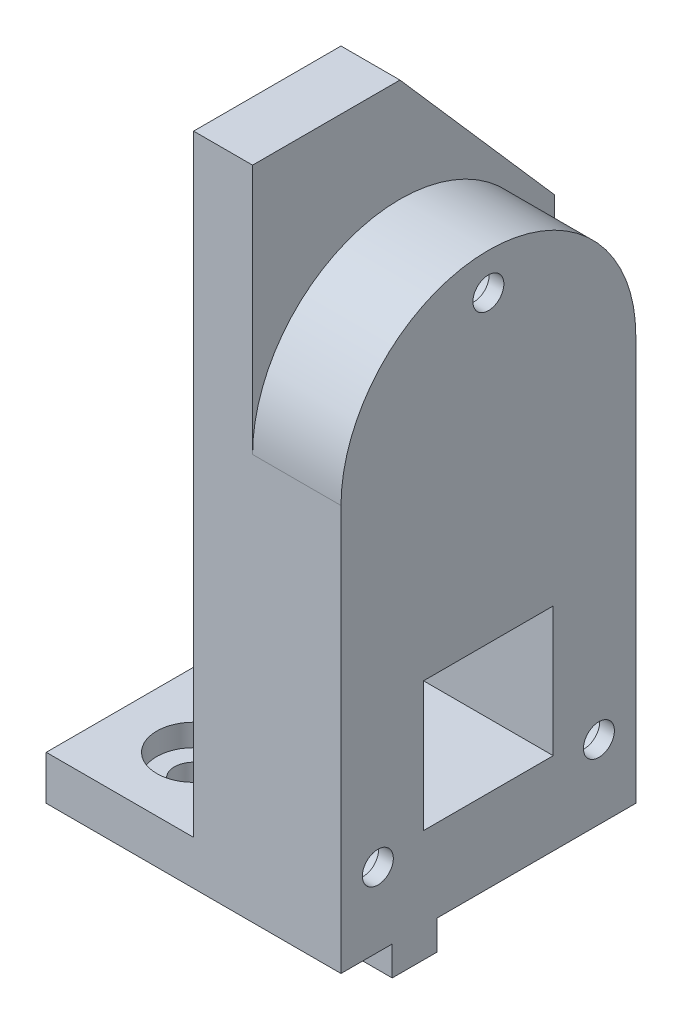
ISO-10303-21;
HEADER;
FILE_DESCRIPTION(('STEP AP214'),'2;1');
FILE_NAME('part.step','',(''),(''),'','','');
FILE_SCHEMA(('AUTOMOTIVE_DESIGN { 1 0 10303 214 1 1 1 1 }'));
ENDSEC;
DATA;
#1=APPLICATION_CONTEXT('core data for automotive mechanical design processes');
#2=APPLICATION_PROTOCOL_DEFINITION('international standard','automotive_design',2000,#1);
#3=PRODUCT_CONTEXT('',#1,'mechanical');
#4=PRODUCT('Part','Part','',(#3));
#5=PRODUCT_RELATED_PRODUCT_CATEGORY('part','',(#4));
#6=PRODUCT_DEFINITION_FORMATION('','',#4);
#7=PRODUCT_DEFINITION_CONTEXT('part definition',#1,'design');
#8=PRODUCT_DEFINITION('design','',#6,#7);
#9=PRODUCT_DEFINITION_SHAPE('','',#8);
#10=(LENGTH_UNIT() NAMED_UNIT(*) SI_UNIT(.MILLI.,.METRE.));
#11=(NAMED_UNIT(*) PLANE_ANGLE_UNIT() SI_UNIT($,.RADIAN.));
#12=(NAMED_UNIT(*) SI_UNIT($,.STERADIAN.) SOLID_ANGLE_UNIT());
#13=UNCERTAINTY_MEASURE_WITH_UNIT(LENGTH_MEASURE(1.E-05),#10,'distance_accuracy_value','');
#14=(GEOMETRIC_REPRESENTATION_CONTEXT(3) GLOBAL_UNCERTAINTY_ASSIGNED_CONTEXT((#13)) GLOBAL_UNIT_ASSIGNED_CONTEXT((#10,
#11,#12)) REPRESENTATION_CONTEXT('',''));
#15=CARTESIAN_POINT('',(0.,0.,0.));
#16=DIRECTION('',(0.,0.,1.));
#17=DIRECTION('',(1.,0.,0.));
#18=AXIS2_PLACEMENT_3D('',#15,#16,#17);
#19=CARTESIAN_POINT('',(-10.,6.,0.));
#20=DIRECTION('',(-1.,0.,0.));
#21=DIRECTION('',(0.,0.,1.));
#22=AXIS2_PLACEMENT_3D('',#19,#20,#21);
#23=PLANE('',#22);
#24=CARTESIAN_POINT('',(-10.,70.,0.));
#25=DIRECTION('',(-1.,0.,0.));
#26=DIRECTION('',(0.,0.,1.));
#27=AXIS2_PLACEMENT_3D('',#24,#25,#26);
#28=CIRCLE('',#27,3.5);
#29=CARTESIAN_POINT('',(-10.,70.,3.5));
#30=VERTEX_POINT('',#29);
#31=EDGE_CURVE('E287',#30,#30,#28,.T.);
#32=ORIENTED_EDGE('',*,*,#31,.F.);
#33=EDGE_LOOP('',(#32));
#34=FACE_BOUND('',#33,.T.);
#35=CARTESIAN_POINT('',(-10.,10.,-15.));
#36=DIRECTION('',(-1.,0.,0.));
#37=DIRECTION('',(0.,0.,1.));
#38=AXIS2_PLACEMENT_3D('',#35,#36,#37);
#39=CIRCLE('',#38,3.5);
#40=CARTESIAN_POINT('',(-10.,10.,-11.5));
#41=VERTEX_POINT('',#40);
#42=EDGE_CURVE('E294',#41,#41,#39,.T.);
#43=ORIENTED_EDGE('',*,*,#42,.F.);
#44=EDGE_LOOP('',(#43));
#45=FACE_BOUND('',#44,.T.);
#46=CARTESIAN_POINT('',(-10.,10.,15.));
#47=DIRECTION('',(-1.,0.,0.));
#48=DIRECTION('',(0.,0.,1.));
#49=AXIS2_PLACEMENT_3D('',#46,#47,#48);
#50=CIRCLE('',#49,3.5);
#51=CARTESIAN_POINT('',(-10.,10.,18.5));
#52=VERTEX_POINT('',#51);
#53=EDGE_CURVE('E298',#52,#52,#50,.T.);
#54=ORIENTED_EDGE('',*,*,#53,.F.);
#55=EDGE_LOOP('',(#54));
#56=FACE_BOUND('',#55,.T.);
#57=DIRECTION('',(0.,0.,1.));
#58=VECTOR('',#57,1.);
#59=CARTESIAN_POINT('',(-10.,28.8,0.));
#60=LINE('',#59,#58);
#61=CARTESIAN_POINT('',(-10.,28.8,-8.8));
#62=VERTEX_POINT('',#61);
#63=CARTESIAN_POINT('',(-10.,28.8,8.8));
#64=VERTEX_POINT('',#63);
#65=EDGE_CURVE('E310',#62,#64,#60,.T.);
#66=ORIENTED_EDGE('',*,*,#65,.T.);
#67=DIRECTION('',(0.,-1.,0.));
#68=VECTOR('',#67,1.);
#69=CARTESIAN_POINT('',(-10.,0.,8.8));
#70=LINE('',#69,#68);
#71=CARTESIAN_POINT('',(-10.,11.2,8.8));
#72=VERTEX_POINT('',#71);
#73=EDGE_CURVE('E307',#64,#72,#70,.T.);
#74=ORIENTED_EDGE('',*,*,#73,.T.);
#75=DIRECTION('',(0.,0.,1.));
#76=VECTOR('',#75,1.);
#77=CARTESIAN_POINT('',(-10.,11.2,0.));
#78=LINE('',#77,#76);
#79=CARTESIAN_POINT('',(-10.,11.2,-8.8));
#80=VERTEX_POINT('',#79);
#81=EDGE_CURVE('E317',#80,#72,#78,.T.);
#82=ORIENTED_EDGE('',*,*,#81,.F.);
#83=DIRECTION('',(0.,-1.,0.));
#84=VECTOR('',#83,1.);
#85=CARTESIAN_POINT('',(-10.,0.,-8.8));
#86=LINE('',#85,#84);
#87=EDGE_CURVE('E314',#62,#80,#86,.T.);
#88=ORIENTED_EDGE('',*,*,#87,.F.);
#89=EDGE_LOOP('',(#66,#74,#82,#88));
#90=FACE_BOUND('',#89,.T.);
#91=DIRECTION('',(0.,-1.,0.));
#92=VECTOR('',#91,1.);
#93=CARTESIAN_POINT('',(-10.,3.,0.));
#94=LINE('',#93,#92);
#95=CARTESIAN_POINT('',(-10.,6.,0.));
#96=VERTEX_POINT('',#95);
#97=CARTESIAN_POINT('',(-10.,0.,0.));
#98=VERTEX_POINT('',#97);
#99=EDGE_CURVE('E65',#96,#98,#94,.T.);
#100=ORIENTED_EDGE('',*,*,#99,.F.);
#101=DIRECTION('',(0.,0.,1.));
#102=VECTOR('',#101,1.);
#103=CARTESIAN_POINT('',(-10.,6.,0.));
#104=LINE('',#103,#102);
#105=CARTESIAN_POINT('',(-10.,6.00000000000001,20.));
#106=VERTEX_POINT('',#105);
#107=EDGE_CURVE('E69',#96,#106,#104,.T.);
#108=ORIENTED_EDGE('',*,*,#107,.T.);
#109=DIRECTION('',(0.,-1.,0.));
#110=VECTOR('',#109,1.);
#111=CARTESIAN_POINT('',(-10.,75.,20.));
#112=LINE('',#111,#110);
#113=CARTESIAN_POINT('',(-10.,89.,20.));
#114=VERTEX_POINT('',#113);
#115=EDGE_CURVE('E323',#114,#106,#112,.T.);
#116=ORIENTED_EDGE('',*,*,#115,.F.);
#117=DIRECTION('',(0.,0.,-1.));
#118=VECTOR('',#117,1.);
#119=CARTESIAN_POINT('',(-10.,89.,20.));
#120=LINE('',#119,#118);
#121=CARTESIAN_POINT('',(-10.,89.,0.));
#122=VERTEX_POINT('',#121);
#123=EDGE_CURVE('E217',#114,#122,#120,.T.);
#124=ORIENTED_EDGE('',*,*,#123,.T.);
#125=DIRECTION('',(0.,0.752576694706878,0.658504607868518));
#126=VECTOR('',#125,1.);
#127=CARTESIAN_POINT('',(-10.,65.,-21.));
#128=LINE('',#127,#126);
#129=CARTESIAN_POINT('',(-10.,65.,-21.));
#130=VERTEX_POINT('',#129);
#131=EDGE_CURVE('E238',#130,#122,#128,.T.);
#132=ORIENTED_EDGE('',*,*,#131,.F.);
#133=DIRECTION('',(0.,1.,0.));
#134=VECTOR('',#133,1.);
#135=CARTESIAN_POINT('',(-10.,0.,-21.));
#136=LINE('',#135,#134);
#137=CARTESIAN_POINT('',(-10.,0.,-21.));
#138=VERTEX_POINT('',#137);
#139=EDGE_CURVE('E221',#138,#130,#136,.T.);
#140=ORIENTED_EDGE('',*,*,#139,.F.);
#141=DIRECTION('',(0.,0.,-1.));
#142=VECTOR('',#141,1.);
#143=CARTESIAN_POINT('',(-10.,0.,0.));
#144=LINE('',#143,#142);
#145=EDGE_CURVE('E336',#98,#138,#144,.T.);
#146=ORIENTED_EDGE('',*,*,#145,.F.);
#147=EDGE_LOOP('',(#100,#108,#116,#124,#132,#140,#146));
#148=FACE_BOUND('',#147,.T.);
#149=ADVANCED_FACE('F51',(#34,#45,#56,#90,#148),#23,.T.);
#150=CARTESIAN_POINT('',(0.,3.,0.));
#151=DIRECTION('',(0.,1.,0.));
#152=DIRECTION('',(0.,0.,1.));
#153=AXIS2_PLACEMENT_3D('',#150,#151,#152);
#154=PLANE('',#153);
#155=CARTESIAN_POINT('',(-20.,3.,9.99999999999999));
#156=DIRECTION('',(0.,1.,0.));
#157=DIRECTION('',(0.,0.,1.));
#158=AXIS2_PLACEMENT_3D('',#155,#156,#157);
#159=CIRCLE('',#158,2.6);
#160=CARTESIAN_POINT('',(-20.,3.,12.6));
#161=VERTEX_POINT('',#160);
#162=EDGE_CURVE('E209',#161,#161,#159,.T.);
#163=ORIENTED_EDGE('',*,*,#162,.F.);
#164=EDGE_LOOP('',(#163));
#165=FACE_BOUND('',#164,.T.);
#166=CARTESIAN_POINT('',(-20.,3.,9.99999999999999));
#167=DIRECTION('',(0.,1.,0.));
#168=DIRECTION('',(0.,0.,1.));
#169=AXIS2_PLACEMENT_3D('',#166,#167,#168);
#170=CIRCLE('',#169,5.);
#171=CARTESIAN_POINT('',(-20.,3.,15.));
#172=VERTEX_POINT('',#171);
#173=EDGE_CURVE('E12',#172,#172,#170,.F.);
#174=ORIENTED_EDGE('',*,*,#173,.F.);
#175=EDGE_LOOP('',(#174));
#176=FACE_BOUND('',#175,.T.);
#177=ADVANCED_FACE('F373',(#165,#176),#154,.T.);
#178=DIRECTION('',(0.,1.,0.));
#179=VECTOR('',#178,1.);
#180=CARTESIAN_POINT('',(-10.,-4.,13.05));
#181=LINE('',#180,#179);
#182=CARTESIAN_POINT('',(-10.,-4.,13.05));
#183=VERTEX_POINT('',#182);
#184=CARTESIAN_POINT('',(-10.,0.,13.05));
#185=VERTEX_POINT('',#184);
#186=EDGE_CURVE('E283',#183,#185,#181,.T.);
#187=ORIENTED_EDGE('',*,*,#186,.T.);
#188=DIRECTION('',(0.,0.,-1.));
#189=VECTOR('',#188,1.);
#190=CARTESIAN_POINT('',(-10.,0.,20.));
#191=LINE('',#190,#189);
#192=CARTESIAN_POINT('',(-10.,0.,6.94999999999999));
#193=VERTEX_POINT('',#192);
#194=EDGE_CURVE('E58',#185,#193,#191,.T.);
#195=ORIENTED_EDGE('',*,*,#194,.T.);
#196=DIRECTION('',(0.,1.,0.));
#197=VECTOR('',#196,1.);
#198=CARTESIAN_POINT('',(-10.,-4.,6.94999999999999));
#199=LINE('',#198,#197);
#200=CARTESIAN_POINT('',(-10.,-4.,6.94999999999999));
#201=VERTEX_POINT('',#200);
#202=EDGE_CURVE('E280',#201,#193,#199,.T.);
#203=ORIENTED_EDGE('',*,*,#202,.F.);
#204=DIRECTION('',(0.,0.,-1.));
#205=VECTOR('',#204,1.);
#206=CARTESIAN_POINT('',(-10.,-4.,0.));
#207=LINE('',#206,#205);
#208=EDGE_CURVE('E262',#183,#201,#207,.T.);
#209=ORIENTED_EDGE('',*,*,#208,.F.);
#210=EDGE_LOOP('',(#187,#195,#203,#209));
#211=FACE_BOUND('',#210,.T.);
#212=ADVANCED_FACE('F376',(#211),#23,.T.);
#213=CARTESIAN_POINT('',(65.,10.,15.));
#214=DIRECTION('',(-1.,0.,0.));
#215=DIRECTION('',(0.,0.,1.));
#216=AXIS2_PLACEMENT_3D('',#213,#214,#215);
#217=CYLINDRICAL_SURFACE('',#216,2.1);
#218=CARTESIAN_POINT('',(10.,10.,15.));
#219=DIRECTION('',(-1.,0.,0.));
#220=DIRECTION('',(0.,0.,1.));
#221=AXIS2_PLACEMENT_3D('',#218,#219,#220);
#222=CIRCLE('',#221,2.1);
#223=CARTESIAN_POINT('',(10.,10.,17.1));
#224=VERTEX_POINT('',#223);
#225=EDGE_CURVE('E306',#224,#224,#222,.T.);
#226=ORIENTED_EDGE('',*,*,#225,.F.);
#227=EDGE_LOOP('',(#226));
#228=FACE_BOUND('',#227,.T.);
#229=CARTESIAN_POINT('',(8.,10.,15.));
#230=DIRECTION('',(-1.,0.,0.));
#231=DIRECTION('',(0.,0.,1.));
#232=AXIS2_PLACEMENT_3D('',#229,#230,#231);
#233=CIRCLE('',#232,2.1);
#234=CARTESIAN_POINT('',(8.,10.,17.1));
#235=VERTEX_POINT('',#234);
#236=EDGE_CURVE('E272',#235,#235,#233,.F.);
#237=ORIENTED_EDGE('',*,*,#236,.F.);
#238=EDGE_LOOP('',(#237));
#239=FACE_BOUND('',#238,.T.);
#240=ADVANCED_FACE('F396',(#228,#239),#217,.F.);
#241=CARTESIAN_POINT('',(65.,10.,-15.));
#242=DIRECTION('',(-1.,0.,0.));
#243=DIRECTION('',(0.,0.,1.));
#244=AXIS2_PLACEMENT_3D('',#241,#242,#243);
#245=CYLINDRICAL_SURFACE('',#244,2.1);
#246=CARTESIAN_POINT('',(10.,10.,-15.));
#247=DIRECTION('',(-1.,0.,0.));
#248=DIRECTION('',(0.,0.,1.));
#249=AXIS2_PLACEMENT_3D('',#246,#247,#248);
#250=CIRCLE('',#249,2.1);
#251=CARTESIAN_POINT('',(10.,10.,-12.9));
#252=VERTEX_POINT('',#251);
#253=EDGE_CURVE('E355',#252,#252,#250,.T.);
#254=ORIENTED_EDGE('',*,*,#253,.F.);
#255=EDGE_LOOP('',(#254));
#256=FACE_BOUND('',#255,.T.);
#257=CARTESIAN_POINT('',(8.,10.,-15.));
#258=DIRECTION('',(-1.,0.,0.));
#259=DIRECTION('',(0.,0.,1.));
#260=AXIS2_PLACEMENT_3D('',#257,#258,#259);
#261=CIRCLE('',#260,2.1);
#262=CARTESIAN_POINT('',(8.,10.,-12.9));
#263=VERTEX_POINT('',#262);
#264=EDGE_CURVE('E256',#263,#263,#261,.F.);
#265=ORIENTED_EDGE('',*,*,#264,.F.);
#266=EDGE_LOOP('',(#265));
#267=FACE_BOUND('',#266,.T.);
#268=ADVANCED_FACE('F401',(#256,#267),#245,.F.);
#269=CARTESIAN_POINT('',(65.,70.,0.));
#270=DIRECTION('',(-1.,0.,0.));
#271=DIRECTION('',(0.,0.,1.));
#272=AXIS2_PLACEMENT_3D('',#269,#270,#271);
#273=CYLINDRICAL_SURFACE('',#272,2.1);
#274=CARTESIAN_POINT('',(10.,70.,0.));
#275=DIRECTION('',(-1.,0.,0.));
#276=DIRECTION('',(0.,0.,1.));
#277=AXIS2_PLACEMENT_3D('',#274,#275,#276);
#278=CIRCLE('',#277,2.1);
#279=CARTESIAN_POINT('',(10.,70.,2.1));
#280=VERTEX_POINT('',#279);
#281=EDGE_CURVE('E311',#280,#280,#278,.T.);
#282=ORIENTED_EDGE('',*,*,#281,.F.);
#283=EDGE_LOOP('',(#282));
#284=FACE_BOUND('',#283,.T.);
#285=CARTESIAN_POINT('',(8.,70.,0.));
#286=DIRECTION('',(-1.,0.,0.));
#287=DIRECTION('',(0.,-1.,0.));
#288=AXIS2_PLACEMENT_3D('',#285,#286,#287);
#289=CIRCLE('',#288,2.1);
#290=CARTESIAN_POINT('',(8.,67.9,0.));
#291=VERTEX_POINT('',#290);
#292=EDGE_CURVE('E293',#291,#291,#289,.F.);
#293=ORIENTED_EDGE('',*,*,#292,.F.);
#294=EDGE_LOOP('',(#293));
#295=FACE_BOUND('',#294,.T.);
#296=ADVANCED_FACE('F477',(#284,#295),#273,.F.);
#297=CARTESIAN_POINT('',(10.,6.,0.));
#298=DIRECTION('',(-1.,0.,0.));
#299=DIRECTION('',(0.,0.,1.));
#300=AXIS2_PLACEMENT_3D('',#297,#298,#299);
#301=PLANE('',#300);
#302=ORIENTED_EDGE('',*,*,#281,.T.);
#303=EDGE_LOOP('',(#302));
#304=FACE_BOUND('',#303,.T.);
#305=ORIENTED_EDGE('',*,*,#253,.T.);
#306=EDGE_LOOP('',(#305));
#307=FACE_BOUND('',#306,.T.);
#308=ORIENTED_EDGE('',*,*,#225,.T.);
#309=EDGE_LOOP('',(#308));
#310=FACE_BOUND('',#309,.T.);
#311=DIRECTION('',(0.,-1.,0.));
#312=VECTOR('',#311,1.);
#313=CARTESIAN_POINT('',(10.,6.,8.8));
#314=LINE('',#313,#312);
#315=CARTESIAN_POINT('',(10.,28.8,8.8));
#316=VERTEX_POINT('',#315);
#317=CARTESIAN_POINT('',(10.,11.2,8.8));
#318=VERTEX_POINT('',#317);
#319=EDGE_CURVE('E350',#316,#318,#314,.T.);
#320=ORIENTED_EDGE('',*,*,#319,.F.);
#321=DIRECTION('',(0.,0.,1.));
#322=VECTOR('',#321,1.);
#323=CARTESIAN_POINT('',(10.,28.8,0.));
#324=LINE('',#323,#322);
#325=CARTESIAN_POINT('',(10.,28.8,-8.8));
#326=VERTEX_POINT('',#325);
#327=EDGE_CURVE('E342',#326,#316,#324,.T.);
#328=ORIENTED_EDGE('',*,*,#327,.F.);
#329=DIRECTION('',(0.,-1.,0.));
#330=VECTOR('',#329,1.);
#331=CARTESIAN_POINT('',(10.,6.,-8.8));
#332=LINE('',#331,#330);
#333=CARTESIAN_POINT('',(10.,11.2,-8.8));
#334=VERTEX_POINT('',#333);
#335=EDGE_CURVE('E344',#326,#334,#332,.T.);
#336=ORIENTED_EDGE('',*,*,#335,.T.);
#337=DIRECTION('',(0.,0.,1.));
#338=VECTOR('',#337,1.);
#339=CARTESIAN_POINT('',(10.,11.2,0.));
#340=LINE('',#339,#338);
#341=EDGE_CURVE('E347',#334,#318,#340,.T.);
#342=ORIENTED_EDGE('',*,*,#341,.T.);
#343=EDGE_LOOP('',(#320,#328,#336,#342));
#344=FACE_BOUND('',#343,.T.);
#345=DIRECTION('',(0.,0.,-1.));
#346=VECTOR('',#345,1.);
#347=CARTESIAN_POINT('',(10.,0.,0.));
#348=LINE('',#347,#346);
#349=CARTESIAN_POINT('',(10.,0.,20.));
#350=VERTEX_POINT('',#349);
#351=CARTESIAN_POINT('',(10.,0.,13.05));
#352=VERTEX_POINT('',#351);
#353=EDGE_CURVE('E339',#350,#352,#348,.T.);
#354=ORIENTED_EDGE('',*,*,#353,.T.);
#355=DIRECTION('',(0.,1.,0.));
#356=VECTOR('',#355,1.);
#357=CARTESIAN_POINT('',(10.,-4.,13.05));
#358=LINE('',#357,#356);
#359=CARTESIAN_POINT('',(10.,-4.,13.05));
#360=VERTEX_POINT('',#359);
#361=EDGE_CURVE('E269',#360,#352,#358,.T.);
#362=ORIENTED_EDGE('',*,*,#361,.F.);
#363=DIRECTION('',(0.,0.,1.));
#364=VECTOR('',#363,1.);
#365=CARTESIAN_POINT('',(10.,-4.,0.));
#366=LINE('',#365,#364);
#367=CARTESIAN_POINT('',(10.,-4.,6.94999999999999));
#368=VERTEX_POINT('',#367);
#369=EDGE_CURVE('E267',#368,#360,#366,.T.);
#370=ORIENTED_EDGE('',*,*,#369,.F.);
#371=DIRECTION('',(0.,1.,0.));
#372=VECTOR('',#371,1.);
#373=CARTESIAN_POINT('',(10.,-4.,6.94999999999999));
#374=LINE('',#373,#372);
#375=CARTESIAN_POINT('',(10.,0.,6.94999999999999));
#376=VERTEX_POINT('',#375);
#377=EDGE_CURVE('E277',#368,#376,#374,.T.);
#378=ORIENTED_EDGE('',*,*,#377,.T.);
#379=CARTESIAN_POINT('',(10.,0.,-20.));
#380=VERTEX_POINT('',#379);
#381=EDGE_CURVE('E338',#376,#380,#348,.T.);
#382=ORIENTED_EDGE('',*,*,#381,.T.);
#383=DIRECTION('',(0.,-1.,0.));
#384=VECTOR('',#383,1.);
#385=CARTESIAN_POINT('',(10.,75.,-20.));
#386=LINE('',#385,#384);
#387=CARTESIAN_POINT('',(10.,55.,-20.));
#388=VERTEX_POINT('',#387);
#389=EDGE_CURVE('E331',#388,#380,#386,.T.);
#390=ORIENTED_EDGE('',*,*,#389,.F.);
#391=CARTESIAN_POINT('',(10.,55.,0.));
#392=DIRECTION('',(-1.,0.,0.));
#393=DIRECTION('',(0.,0.,1.));
#394=AXIS2_PLACEMENT_3D('',#391,#392,#393);
#395=CIRCLE('',#394,20.);
#396=CARTESIAN_POINT('',(10.,55.,20.));
#397=VERTEX_POINT('',#396);
#398=EDGE_CURVE('E303',#388,#397,#395,.F.);
#399=ORIENTED_EDGE('',*,*,#398,.T.);
#400=DIRECTION('',(0.,-1.,0.));
#401=VECTOR('',#400,1.);
#402=CARTESIAN_POINT('',(10.,75.,20.));
#403=LINE('',#402,#401);
#404=EDGE_CURVE('E334',#397,#350,#403,.T.);
#405=ORIENTED_EDGE('',*,*,#404,.T.);
#406=EDGE_LOOP('',(#354,#362,#370,#378,#382,#390,#399,#405));
#407=FACE_BOUND('',#406,.T.);
#408=ADVANCED_FACE('F425',(#304,#307,#310,#344,#407),#301,.F.);
#409=CARTESIAN_POINT('',(-10.,75.,20.));
#410=DIRECTION('',(0.,0.,-1.));
#411=DIRECTION('',(-1.,0.,0.));
#412=AXIS2_PLACEMENT_3D('',#409,#410,#411);
#413=PLANE('',#412);
#414=DIRECTION('',(-1.,0.,0.));
#415=VECTOR('',#414,1.);
#416=CARTESIAN_POINT('',(65.,55.,20.));
#417=LINE('',#416,#415);
#418=CARTESIAN_POINT('',(-2.,55.,20.));
#419=VERTEX_POINT('',#418);
#420=EDGE_CURVE('E352',#419,#397,#417,.F.);
#421=ORIENTED_EDGE('',*,*,#420,.F.);
#422=DIRECTION('',(0.,1.,0.));
#423=VECTOR('',#422,1.);
#424=CARTESIAN_POINT('',(-2.,55.,20.));
#425=LINE('',#424,#423);
#426=CARTESIAN_POINT('',(-2.,89.,20.));
#427=VERTEX_POINT('',#426);
#428=EDGE_CURVE('E220',#419,#427,#425,.T.);
#429=ORIENTED_EDGE('',*,*,#428,.T.);
#430=DIRECTION('',(-1.,0.,0.));
#431=VECTOR('',#430,1.);
#432=CARTESIAN_POINT('',(-2.,89.,20.));
#433=LINE('',#432,#431);
#434=EDGE_CURVE('E235',#427,#114,#433,.T.);
#435=ORIENTED_EDGE('',*,*,#434,.T.);
#436=ORIENTED_EDGE('',*,*,#115,.T.);
#437=DIRECTION('',(1.,0.,0.));
#438=VECTOR('',#437,1.);
#439=CARTESIAN_POINT('',(-30.,6.,20.));
#440=LINE('',#439,#438);
#441=CARTESIAN_POINT('',(-30.,6.,20.));
#442=VERTEX_POINT('',#441);
#443=EDGE_CURVE('E203',#442,#106,#440,.T.);
#444=ORIENTED_EDGE('',*,*,#443,.F.);
#445=DIRECTION('',(0.,-1.,0.));
#446=VECTOR('',#445,1.);
#447=CARTESIAN_POINT('',(-30.,3.,20.));
#448=LINE('',#447,#446);
#449=CARTESIAN_POINT('',(-30.,0.,20.));
#450=VERTEX_POINT('',#449);
#451=EDGE_CURVE('E194',#442,#450,#448,.T.);
#452=ORIENTED_EDGE('',*,*,#451,.T.);
#453=DIRECTION('',(-1.,0.,0.));
#454=VECTOR('',#453,1.);
#455=CARTESIAN_POINT('',(0.,0.,20.));
#456=LINE('',#455,#454);
#457=EDGE_CURVE('E285',#350,#450,#456,.T.);
#458=ORIENTED_EDGE('',*,*,#457,.F.);
#459=ORIENTED_EDGE('',*,*,#404,.F.);
#460=EDGE_LOOP('',(#421,#429,#435,#436,#444,#452,#458,#459));
#461=FACE_BOUND('',#460,.T.);
#462=ADVANCED_FACE('F430',(#461),#413,.F.);
#463=CARTESIAN_POINT('',(-10.,75.,-20.));
#464=DIRECTION('',(0.,0.,-1.));
#465=DIRECTION('',(-1.,0.,0.));
#466=AXIS2_PLACEMENT_3D('',#463,#464,#465);
#467=PLANE('',#466);
#468=DIRECTION('',(0.,1.,0.));
#469=VECTOR('',#468,1.);
#470=CARTESIAN_POINT('',(-2.,0.,-20.));
#471=LINE('',#470,#469);
#472=CARTESIAN_POINT('',(-2.,0.,-20.));
#473=VERTEX_POINT('',#472);
#474=CARTESIAN_POINT('',(-2.,55.,-20.));
#475=VERTEX_POINT('',#474);
#476=EDGE_CURVE('E233',#473,#475,#471,.T.);
#477=ORIENTED_EDGE('',*,*,#476,.T.);
#478=DIRECTION('',(-1.,0.,0.));
#479=VECTOR('',#478,1.);
#480=CARTESIAN_POINT('',(65.,55.,-20.));
#481=LINE('',#480,#479);
#482=EDGE_CURVE('E297',#388,#475,#481,.T.);
#483=ORIENTED_EDGE('',*,*,#482,.F.);
#484=ORIENTED_EDGE('',*,*,#389,.T.);
#485=DIRECTION('',(1.,0.,0.));
#486=VECTOR('',#485,1.);
#487=CARTESIAN_POINT('',(0.,0.,-20.));
#488=LINE('',#487,#486);
#489=EDGE_CURVE('E213',#473,#380,#488,.T.);
#490=ORIENTED_EDGE('',*,*,#489,.F.);
#491=EDGE_LOOP('',(#477,#483,#484,#490));
#492=FACE_BOUND('',#491,.T.);
#493=ADVANCED_FACE('F457',(#492),#467,.T.);
#494=CARTESIAN_POINT('',(0.,0.,0.));
#495=DIRECTION('',(0.,1.,0.));
#496=DIRECTION('',(0.,0.,1.));
#497=AXIS2_PLACEMENT_3D('',#494,#495,#496);
#498=PLANE('',#497);
#499=CARTESIAN_POINT('',(-20.,0.,9.99999999999999));
#500=DIRECTION('',(0.,-1.,0.));
#501=DIRECTION('',(0.,0.,-1.));
#502=AXIS2_PLACEMENT_3D('',#499,#500,#501);
#503=CIRCLE('',#502,2.6);
#504=CARTESIAN_POINT('',(-20.,0.,7.4));
#505=VERTEX_POINT('',#504);
#506=EDGE_CURVE('E198',#505,#505,#503,.T.);
#507=ORIENTED_EDGE('',*,*,#506,.F.);
#508=EDGE_LOOP('',(#507));
#509=FACE_BOUND('',#508,.T.);
#510=ORIENTED_EDGE('',*,*,#457,.T.);
#511=DIRECTION('',(0.,0.,1.));
#512=VECTOR('',#511,1.);
#513=CARTESIAN_POINT('',(-30.,0.,0.));
#514=LINE('',#513,#512);
#515=CARTESIAN_POINT('',(-30.,0.,0.));
#516=VERTEX_POINT('',#515);
#517=EDGE_CURVE('E210',#516,#450,#514,.T.);
#518=ORIENTED_EDGE('',*,*,#517,.F.);
#519=DIRECTION('',(-1.,0.,0.));
#520=VECTOR('',#519,1.);
#521=CARTESIAN_POINT('',(-10.,0.,0.));
#522=LINE('',#521,#520);
#523=EDGE_CURVE('E185',#98,#516,#522,.T.);
#524=ORIENTED_EDGE('',*,*,#523,.F.);
#525=ORIENTED_EDGE('',*,*,#145,.T.);
#526=DIRECTION('',(-1.,0.,0.));
#527=VECTOR('',#526,1.);
#528=CARTESIAN_POINT('',(-2.,0.,-21.));
#529=LINE('',#528,#527);
#530=CARTESIAN_POINT('',(-2.,0.,-21.));
#531=VERTEX_POINT('',#530);
#532=EDGE_CURVE('E242',#531,#138,#529,.T.);
#533=ORIENTED_EDGE('',*,*,#532,.F.);
#534=DIRECTION('',(0.,0.,-1.));
#535=VECTOR('',#534,1.);
#536=CARTESIAN_POINT('',(-2.,0.,-20.));
#537=LINE('',#536,#535);
#538=EDGE_CURVE('E231',#473,#531,#537,.T.);
#539=ORIENTED_EDGE('',*,*,#538,.F.);
#540=ORIENTED_EDGE('',*,*,#489,.T.);
#541=ORIENTED_EDGE('',*,*,#381,.F.);
#542=DIRECTION('',(1.,0.,0.));
#543=VECTOR('',#542,1.);
#544=CARTESIAN_POINT('',(0.,0.,6.94999999999999));
#545=LINE('',#544,#543);
#546=EDGE_CURVE('E263',#193,#376,#545,.T.);
#547=ORIENTED_EDGE('',*,*,#546,.F.);
#548=ORIENTED_EDGE('',*,*,#194,.F.);
#549=DIRECTION('',(1.,0.,0.));
#550=VECTOR('',#549,1.);
#551=CARTESIAN_POINT('',(0.,0.,13.05));
#552=LINE('',#551,#550);
#553=EDGE_CURVE('E270',#185,#352,#552,.T.);
#554=ORIENTED_EDGE('',*,*,#553,.T.);
#555=ORIENTED_EDGE('',*,*,#353,.F.);
#556=EDGE_LOOP('',(#510,#518,#524,#525,#533,#539,#540,#541,#547,#548,#554,#555));
#557=FACE_BOUND('',#556,.T.);
#558=ADVANCED_FACE('F415',(#509,#557),#498,.F.);
#559=CARTESIAN_POINT('',(65.,0.,8.8));
#560=DIRECTION('',(0.,0.,-1.));
#561=DIRECTION('',(-1.,0.,0.));
#562=AXIS2_PLACEMENT_3D('',#559,#560,#561);
#563=PLANE('',#562);
#564=ORIENTED_EDGE('',*,*,#319,.T.);
#565=DIRECTION('',(-1.,0.,0.));
#566=VECTOR('',#565,1.);
#567=CARTESIAN_POINT('',(65.,11.2,8.8));
#568=LINE('',#567,#566);
#569=EDGE_CURVE('E321',#318,#72,#568,.T.);
#570=ORIENTED_EDGE('',*,*,#569,.T.);
#571=ORIENTED_EDGE('',*,*,#73,.F.);
#572=DIRECTION('',(-1.,0.,0.));
#573=VECTOR('',#572,1.);
#574=CARTESIAN_POINT('',(65.,28.8,8.8));
#575=LINE('',#574,#573);
#576=EDGE_CURVE('E320',#316,#64,#575,.T.);
#577=ORIENTED_EDGE('',*,*,#576,.F.);
#578=EDGE_LOOP('',(#564,#570,#571,#577));
#579=FACE_BOUND('',#578,.T.);
#580=ADVANCED_FACE('F487',(#579),#563,.T.);
#581=CARTESIAN_POINT('',(65.,11.2,0.));
#582=DIRECTION('',(0.,-1.,0.));
#583=DIRECTION('',(0.,0.,-1.));
#584=AXIS2_PLACEMENT_3D('',#581,#582,#583);
#585=PLANE('',#584);
#586=DIRECTION('',(-1.,0.,0.));
#587=VECTOR('',#586,1.);
#588=CARTESIAN_POINT('',(65.,11.2,-8.8));
#589=LINE('',#588,#587);
#590=EDGE_CURVE('E324',#334,#80,#589,.T.);
#591=ORIENTED_EDGE('',*,*,#590,.T.);
#592=ORIENTED_EDGE('',*,*,#81,.T.);
#593=ORIENTED_EDGE('',*,*,#569,.F.);
#594=ORIENTED_EDGE('',*,*,#341,.F.);
#595=EDGE_LOOP('',(#591,#592,#593,#594));
#596=FACE_BOUND('',#595,.T.);
#597=ADVANCED_FACE('F484',(#596),#585,.F.);
#598=CARTESIAN_POINT('',(65.,0.,-8.8));
#599=DIRECTION('',(0.,0.,-1.));
#600=DIRECTION('',(-1.,0.,0.));
#601=AXIS2_PLACEMENT_3D('',#598,#599,#600);
#602=PLANE('',#601);
#603=DIRECTION('',(-1.,0.,0.));
#604=VECTOR('',#603,1.);
#605=CARTESIAN_POINT('',(65.,28.8,-8.8));
#606=LINE('',#605,#604);
#607=EDGE_CURVE('E326',#326,#62,#606,.T.);
#608=ORIENTED_EDGE('',*,*,#607,.T.);
#609=ORIENTED_EDGE('',*,*,#87,.T.);
#610=ORIENTED_EDGE('',*,*,#590,.F.);
#611=ORIENTED_EDGE('',*,*,#335,.F.);
#612=EDGE_LOOP('',(#608,#609,#610,#611));
#613=FACE_BOUND('',#612,.T.);
#614=ADVANCED_FACE('F472',(#613),#602,.F.);
#615=CARTESIAN_POINT('',(65.,28.8,0.));
#616=DIRECTION('',(0.,-1.,0.));
#617=DIRECTION('',(0.,0.,-1.));
#618=AXIS2_PLACEMENT_3D('',#615,#616,#617);
#619=PLANE('',#618);
#620=ORIENTED_EDGE('',*,*,#327,.T.);
#621=ORIENTED_EDGE('',*,*,#576,.T.);
#622=ORIENTED_EDGE('',*,*,#65,.F.);
#623=ORIENTED_EDGE('',*,*,#607,.F.);
#624=EDGE_LOOP('',(#620,#621,#622,#623));
#625=FACE_BOUND('',#624,.T.);
#626=ADVANCED_FACE('F463',(#625),#619,.T.);
#627=CARTESIAN_POINT('',(65.,55.,0.));
#628=DIRECTION('',(-1.,0.,0.));
#629=DIRECTION('',(0.,0.,1.));
#630=AXIS2_PLACEMENT_3D('',#627,#628,#629);
#631=CYLINDRICAL_SURFACE('',#630,20.);
#632=ORIENTED_EDGE('',*,*,#482,.T.);
#633=CARTESIAN_POINT('',(-2.,55.,0.));
#634=DIRECTION('',(1.,0.,0.));
#635=DIRECTION('',(0.,0.,-1.));
#636=AXIS2_PLACEMENT_3D('',#633,#634,#635);
#637=CIRCLE('',#636,20.);
#638=EDGE_CURVE('E218',#475,#419,#637,.T.);
#639=ORIENTED_EDGE('',*,*,#638,.T.);
#640=ORIENTED_EDGE('',*,*,#420,.T.);
#641=ORIENTED_EDGE('',*,*,#398,.F.);
#642=EDGE_LOOP('',(#632,#639,#640,#641));
#643=FACE_BOUND('',#642,.T.);
#644=ADVANCED_FACE('F460',(#643),#631,.T.);
#645=CARTESIAN_POINT('',(-7.,10.,-15.));
#646=DIRECTION('',(-1.,0.,0.));
#647=DIRECTION('',(0.,0.,1.));
#648=AXIS2_PLACEMENT_3D('',#645,#646,#647);
#649=CYLINDRICAL_SURFACE('',#648,3.5);
#650=ORIENTED_EDGE('',*,*,#42,.T.);
#651=EDGE_LOOP('',(#650));
#652=FACE_BOUND('',#651,.T.);
#653=CARTESIAN_POINT('',(8.,10.,-15.));
#654=DIRECTION('',(-1.,0.,0.));
#655=DIRECTION('',(0.,0.,1.));
#656=AXIS2_PLACEMENT_3D('',#653,#654,#655);
#657=CIRCLE('',#656,3.5);
#658=CARTESIAN_POINT('',(8.,10.,-11.5));
#659=VERTEX_POINT('',#658);
#660=EDGE_CURVE('E245',#659,#659,#657,.T.);
#661=ORIENTED_EDGE('',*,*,#660,.F.);
#662=EDGE_LOOP('',(#661));
#663=FACE_BOUND('',#662,.T.);
#664=ADVANCED_FACE('F462',(#652,#663),#649,.F.);
#665=CARTESIAN_POINT('',(-7.,10.,15.));
#666=DIRECTION('',(-1.,0.,0.));
#667=DIRECTION('',(0.,0.,1.));
#668=AXIS2_PLACEMENT_3D('',#665,#666,#667);
#669=CYLINDRICAL_SURFACE('',#668,3.5);
#670=ORIENTED_EDGE('',*,*,#53,.T.);
#671=EDGE_LOOP('',(#670));
#672=FACE_BOUND('',#671,.T.);
#673=CARTESIAN_POINT('',(8.,10.,15.));
#674=DIRECTION('',(-1.,0.,0.));
#675=DIRECTION('',(0.,0.,1.));
#676=AXIS2_PLACEMENT_3D('',#673,#674,#675);
#677=CIRCLE('',#676,3.5);
#678=CARTESIAN_POINT('',(8.,10.,18.5));
#679=VERTEX_POINT('',#678);
#680=EDGE_CURVE('E253',#679,#679,#677,.T.);
#681=ORIENTED_EDGE('',*,*,#680,.F.);
#682=EDGE_LOOP('',(#681));
#683=FACE_BOUND('',#682,.T.);
#684=ADVANCED_FACE('F469',(#672,#683),#669,.F.);
#685=CARTESIAN_POINT('',(8.,70.,0.));
#686=DIRECTION('',(-1.,0.,0.));
#687=DIRECTION('',(0.,-1.,0.));
#688=AXIS2_PLACEMENT_3D('',#685,#686,#687);
#689=PLANE('',#688);
#690=CARTESIAN_POINT('',(8.,70.,0.));
#691=DIRECTION('',(-1.,0.,0.));
#692=DIRECTION('',(0.,-1.,0.));
#693=AXIS2_PLACEMENT_3D('',#690,#691,#692);
#694=CIRCLE('',#693,3.5);
#695=CARTESIAN_POINT('',(8.,66.5,0.));
#696=VERTEX_POINT('',#695);
#697=EDGE_CURVE('E290',#696,#696,#694,.T.);
#698=ORIENTED_EDGE('',*,*,#697,.T.);
#699=EDGE_LOOP('',(#698));
#700=FACE_BOUND('',#699,.T.);
#701=ORIENTED_EDGE('',*,*,#292,.T.);
#702=EDGE_LOOP('',(#701));
#703=FACE_BOUND('',#702,.T.);
#704=ADVANCED_FACE('F546',(#700,#703),#689,.T.);
#705=CARTESIAN_POINT('',(8.,70.,0.));
#706=DIRECTION('',(-1.,0.,0.));
#707=DIRECTION('',(0.,-1.,0.));
#708=AXIS2_PLACEMENT_3D('',#705,#706,#707);
#709=CYLINDRICAL_SURFACE('',#708,3.5);
#710=ORIENTED_EDGE('',*,*,#697,.F.);
#711=EDGE_LOOP('',(#710));
#712=FACE_BOUND('',#711,.T.);
#713=ORIENTED_EDGE('',*,*,#31,.T.);
#714=EDGE_LOOP('',(#713));
#715=FACE_BOUND('',#714,.T.);
#716=ADVANCED_FACE('F545',(#712,#715),#709,.F.);
#717=CARTESIAN_POINT('',(0.,-4.,13.05));
#718=DIRECTION('',(0.,0.,1.));
#719=DIRECTION('',(1.,0.,0.));
#720=AXIS2_PLACEMENT_3D('',#717,#718,#719);
#721=PLANE('',#720);
#722=ORIENTED_EDGE('',*,*,#553,.F.);
#723=ORIENTED_EDGE('',*,*,#186,.F.);
#724=DIRECTION('',(1.,0.,0.));
#725=VECTOR('',#724,1.);
#726=CARTESIAN_POINT('',(0.,-4.,13.05));
#727=LINE('',#726,#725);
#728=EDGE_CURVE('E259',#183,#360,#727,.T.);
#729=ORIENTED_EDGE('',*,*,#728,.T.);
#730=ORIENTED_EDGE('',*,*,#361,.T.);
#731=EDGE_LOOP('',(#722,#723,#729,#730));
#732=FACE_BOUND('',#731,.T.);
#733=ADVANCED_FACE('F411',(#732),#721,.T.);
#734=CARTESIAN_POINT('',(0.,-4.,6.94999999999999));
#735=DIRECTION('',(0.,0.,1.));
#736=DIRECTION('',(1.,0.,0.));
#737=AXIS2_PLACEMENT_3D('',#734,#735,#736);
#738=PLANE('',#737);
#739=ORIENTED_EDGE('',*,*,#546,.T.);
#740=ORIENTED_EDGE('',*,*,#377,.F.);
#741=DIRECTION('',(1.,0.,0.));
#742=VECTOR('',#741,1.);
#743=CARTESIAN_POINT('',(0.,-4.,6.94999999999999));
#744=LINE('',#743,#742);
#745=EDGE_CURVE('E265',#201,#368,#744,.T.);
#746=ORIENTED_EDGE('',*,*,#745,.F.);
#747=ORIENTED_EDGE('',*,*,#202,.T.);
#748=EDGE_LOOP('',(#739,#740,#746,#747));
#749=FACE_BOUND('',#748,.T.);
#750=ADVANCED_FACE('F420',(#749),#738,.F.);
#751=CARTESIAN_POINT('',(0.,-4.,0.));
#752=DIRECTION('',(0.,-1.,0.));
#753=DIRECTION('',(0.,0.,-1.));
#754=AXIS2_PLACEMENT_3D('',#751,#752,#753);
#755=PLANE('',#754);
#756=ORIENTED_EDGE('',*,*,#728,.F.);
#757=ORIENTED_EDGE('',*,*,#208,.T.);
#758=ORIENTED_EDGE('',*,*,#745,.T.);
#759=ORIENTED_EDGE('',*,*,#369,.T.);
#760=EDGE_LOOP('',(#756,#757,#758,#759));
#761=FACE_BOUND('',#760,.T.);
#762=ADVANCED_FACE('F423',(#761),#755,.T.);
#763=CARTESIAN_POINT('',(8.,10.,-15.));
#764=DIRECTION('',(-1.,0.,0.));
#765=DIRECTION('',(0.,0.,1.));
#766=AXIS2_PLACEMENT_3D('',#763,#764,#765);
#767=PLANE('',#766);
#768=ORIENTED_EDGE('',*,*,#660,.T.);
#769=EDGE_LOOP('',(#768));
#770=FACE_BOUND('',#769,.T.);
#771=ORIENTED_EDGE('',*,*,#264,.T.);
#772=EDGE_LOOP('',(#771));
#773=FACE_BOUND('',#772,.T.);
#774=ADVANCED_FACE('F526',(#770,#773),#767,.T.);
#775=CARTESIAN_POINT('',(8.,10.,15.));
#776=DIRECTION('',(-1.,0.,0.));
#777=DIRECTION('',(0.,0.,1.));
#778=AXIS2_PLACEMENT_3D('',#775,#776,#777);
#779=PLANE('',#778);
#780=ORIENTED_EDGE('',*,*,#680,.T.);
#781=EDGE_LOOP('',(#780));
#782=FACE_BOUND('',#781,.T.);
#783=ORIENTED_EDGE('',*,*,#236,.T.);
#784=EDGE_LOOP('',(#783));
#785=FACE_BOUND('',#784,.T.);
#786=ADVANCED_FACE('F524',(#782,#785),#779,.T.);
#787=CARTESIAN_POINT('',(-2.,0.,-21.));
#788=DIRECTION('',(0.,0.,1.));
#789=DIRECTION('',(1.,0.,0.));
#790=AXIS2_PLACEMENT_3D('',#787,#788,#789);
#791=PLANE('',#790);
#792=ORIENTED_EDGE('',*,*,#139,.T.);
#793=DIRECTION('',(-1.,0.,0.));
#794=VECTOR('',#793,1.);
#795=CARTESIAN_POINT('',(-2.,65.,-21.));
#796=LINE('',#795,#794);
#797=CARTESIAN_POINT('',(-2.,65.,-21.));
#798=VERTEX_POINT('',#797);
#799=EDGE_CURVE('E246',#798,#130,#796,.T.);
#800=ORIENTED_EDGE('',*,*,#799,.F.);
#801=DIRECTION('',(0.,1.,0.));
#802=VECTOR('',#801,1.);
#803=CARTESIAN_POINT('',(-2.,0.,-21.));
#804=LINE('',#803,#802);
#805=EDGE_CURVE('E229',#531,#798,#804,.T.);
#806=ORIENTED_EDGE('',*,*,#805,.F.);
#807=ORIENTED_EDGE('',*,*,#532,.T.);
#808=EDGE_LOOP('',(#792,#800,#806,#807));
#809=FACE_BOUND('',#808,.T.);
#810=ADVANCED_FACE('F447',(#809),#791,.F.);
#811=CARTESIAN_POINT('',(-2.,65.,-21.));
#812=DIRECTION('',(0.,-0.658504607868518,0.752576694706878));
#813=DIRECTION('',(0.,-0.752576694706878,-0.658504607868518));
#814=AXIS2_PLACEMENT_3D('',#811,#812,#813);
#815=PLANE('',#814);
#816=ORIENTED_EDGE('',*,*,#131,.T.);
#817=DIRECTION('',(-1.,0.,0.));
#818=VECTOR('',#817,1.);
#819=CARTESIAN_POINT('',(-2.,89.,0.));
#820=LINE('',#819,#818);
#821=CARTESIAN_POINT('',(-2.,89.,0.));
#822=VERTEX_POINT('',#821);
#823=EDGE_CURVE('E249',#822,#122,#820,.T.);
#824=ORIENTED_EDGE('',*,*,#823,.F.);
#825=DIRECTION('',(0.,0.752576694706878,0.658504607868518));
#826=VECTOR('',#825,1.);
#827=CARTESIAN_POINT('',(-2.,65.,-21.));
#828=LINE('',#827,#826);
#829=EDGE_CURVE('E227',#798,#822,#828,.T.);
#830=ORIENTED_EDGE('',*,*,#829,.F.);
#831=ORIENTED_EDGE('',*,*,#799,.T.);
#832=EDGE_LOOP('',(#816,#824,#830,#831));
#833=FACE_BOUND('',#832,.T.);
#834=ADVANCED_FACE('F443',(#833),#815,.F.);
#835=CARTESIAN_POINT('',(-2.,89.,20.));
#836=DIRECTION('',(0.,1.,0.));
#837=DIRECTION('',(0.,0.,1.));
#838=AXIS2_PLACEMENT_3D('',#835,#836,#837);
#839=PLANE('',#838);
#840=ORIENTED_EDGE('',*,*,#123,.F.);
#841=ORIENTED_EDGE('',*,*,#434,.F.);
#842=DIRECTION('',(0.,0.,-1.));
#843=VECTOR('',#842,1.);
#844=CARTESIAN_POINT('',(-2.,89.,20.));
#845=LINE('',#844,#843);
#846=EDGE_CURVE('E224',#427,#822,#845,.T.);
#847=ORIENTED_EDGE('',*,*,#846,.T.);
#848=ORIENTED_EDGE('',*,*,#823,.T.);
#849=EDGE_LOOP('',(#840,#841,#847,#848));
#850=FACE_BOUND('',#849,.T.);
#851=ADVANCED_FACE('F438',(#850),#839,.T.);
#852=CARTESIAN_POINT('',(-2.,55.,0.));
#853=DIRECTION('',(1.,0.,0.));
#854=DIRECTION('',(0.,0.,-1.));
#855=AXIS2_PLACEMENT_3D('',#852,#853,#854);
#856=PLANE('',#855);
#857=ORIENTED_EDGE('',*,*,#638,.F.);
#858=ORIENTED_EDGE('',*,*,#476,.F.);
#859=ORIENTED_EDGE('',*,*,#538,.T.);
#860=ORIENTED_EDGE('',*,*,#805,.T.);
#861=ORIENTED_EDGE('',*,*,#829,.T.);
#862=ORIENTED_EDGE('',*,*,#846,.F.);
#863=ORIENTED_EDGE('',*,*,#428,.F.);
#864=EDGE_LOOP('',(#857,#858,#859,#860,#861,#862,#863));
#865=FACE_BOUND('',#864,.T.);
#866=ADVANCED_FACE('F453',(#865),#856,.T.);
#867=CARTESIAN_POINT('',(-30.,3.,0.));
#868=DIRECTION('',(1.,0.,0.));
#869=DIRECTION('',(0.,0.,-1.));
#870=AXIS2_PLACEMENT_3D('',#867,#868,#869);
#871=PLANE('',#870);
#872=ORIENTED_EDGE('',*,*,#517,.T.);
#873=ORIENTED_EDGE('',*,*,#451,.F.);
#874=DIRECTION('',(0.,0.,1.));
#875=VECTOR('',#874,1.);
#876=CARTESIAN_POINT('',(-30.,6.,0.));
#877=LINE('',#876,#875);
#878=CARTESIAN_POINT('',(-30.,6.,0.));
#879=VERTEX_POINT('',#878);
#880=EDGE_CURVE('E191',#879,#442,#877,.T.);
#881=ORIENTED_EDGE('',*,*,#880,.F.);
#882=DIRECTION('',(0.,-1.,0.));
#883=VECTOR('',#882,1.);
#884=CARTESIAN_POINT('',(-30.,3.,0.));
#885=LINE('',#884,#883);
#886=EDGE_CURVE('E179',#879,#516,#885,.T.);
#887=ORIENTED_EDGE('',*,*,#886,.T.);
#888=EDGE_LOOP('',(#872,#873,#881,#887));
#889=FACE_BOUND('',#888,.T.);
#890=ADVANCED_FACE('F192',(#889),#871,.F.);
#891=CARTESIAN_POINT('',(-10.,3.,0.));
#892=DIRECTION('',(0.,0.,1.));
#893=DIRECTION('',(1.,0.,0.));
#894=AXIS2_PLACEMENT_3D('',#891,#892,#893);
#895=PLANE('',#894);
#896=ORIENTED_EDGE('',*,*,#523,.T.);
#897=ORIENTED_EDGE('',*,*,#886,.F.);
#898=DIRECTION('',(1.,0.,0.));
#899=VECTOR('',#898,1.);
#900=CARTESIAN_POINT('',(-30.,6.,0.));
#901=LINE('',#900,#899);
#902=EDGE_CURVE('E183',#879,#96,#901,.T.);
#903=ORIENTED_EDGE('',*,*,#902,.T.);
#904=ORIENTED_EDGE('',*,*,#99,.T.);
#905=EDGE_LOOP('',(#896,#897,#903,#904));
#906=FACE_BOUND('',#905,.T.);
#907=ADVANCED_FACE('F181',(#906),#895,.F.);
#908=CARTESIAN_POINT('',(-20.,6.,9.99999999999999));
#909=DIRECTION('',(0.,-1.,0.));
#910=DIRECTION('',(0.,0.,-1.));
#911=AXIS2_PLACEMENT_3D('',#908,#909,#910);
#912=CYLINDRICAL_SURFACE('',#911,2.6);
#913=ORIENTED_EDGE('',*,*,#162,.T.);
#914=EDGE_LOOP('',(#913));
#915=FACE_BOUND('',#914,.T.);
#916=ORIENTED_EDGE('',*,*,#506,.T.);
#917=EDGE_LOOP('',(#916));
#918=FACE_BOUND('',#917,.T.);
#919=ADVANCED_FACE('F370',(#915,#918),#912,.F.);
#920=CARTESIAN_POINT('',(0.,6.,0.));
#921=DIRECTION('',(0.,-1.,0.));
#922=DIRECTION('',(0.,0.,-1.));
#923=AXIS2_PLACEMENT_3D('',#920,#921,#922);
#924=PLANE('',#923);
#925=ORIENTED_EDGE('',*,*,#443,.T.);
#926=ORIENTED_EDGE('',*,*,#107,.F.);
#927=ORIENTED_EDGE('',*,*,#902,.F.);
#928=ORIENTED_EDGE('',*,*,#880,.T.);
#929=EDGE_LOOP('',(#925,#926,#927,#928));
#930=FACE_BOUND('',#929,.T.);
#931=CARTESIAN_POINT('',(-20.,6.,9.99999999999999));
#932=DIRECTION('',(0.,1.,0.));
#933=DIRECTION('',(0.,0.,1.));
#934=AXIS2_PLACEMENT_3D('',#931,#932,#933);
#935=CIRCLE('',#934,5.);
#936=CARTESIAN_POINT('',(-20.,6.,15.));
#937=VERTEX_POINT('',#936);
#938=EDGE_CURVE('E431',#937,#937,#935,.T.);
#939=ORIENTED_EDGE('',*,*,#938,.F.);
#940=EDGE_LOOP('',(#939));
#941=FACE_BOUND('',#940,.T.);
#942=ADVANCED_FACE('F200',(#930,#941),#924,.F.);
#943=CARTESIAN_POINT('',(-20.,6.,9.99999999999999));
#944=DIRECTION('',(0.,-1.,0.));
#945=DIRECTION('',(0.,0.,-1.));
#946=AXIS2_PLACEMENT_3D('',#943,#944,#945);
#947=CYLINDRICAL_SURFACE('',#946,5.);
#948=ORIENTED_EDGE('',*,*,#938,.T.);
#949=EDGE_LOOP('',(#948));
#950=FACE_BOUND('',#949,.T.);
#951=ORIENTED_EDGE('',*,*,#173,.T.);
#952=EDGE_LOOP('',(#951));
#953=FACE_BOUND('',#952,.T.);
#954=ADVANCED_FACE('F380',(#950,#953),#947,.F.);
#955=CLOSED_SHELL('',(#149,#177,#212,#240,#268,#296,#408,#462,#493,#558,#580,#597,#614,#626,
#644,#664,#684,#704,#716,#733,#750,#762,#774,#786,#810,#834,#851,#866,#890,#907,#919,#942,#954));
#956=MANIFOLD_SOLID_BREP('B2',#955);
#957=ADVANCED_BREP_SHAPE_REPRESENTATION('',(#18,#956),#14);
#958=SHAPE_DEFINITION_REPRESENTATION(#9,#957);
ENDSEC;
END-ISO-10303-21;
